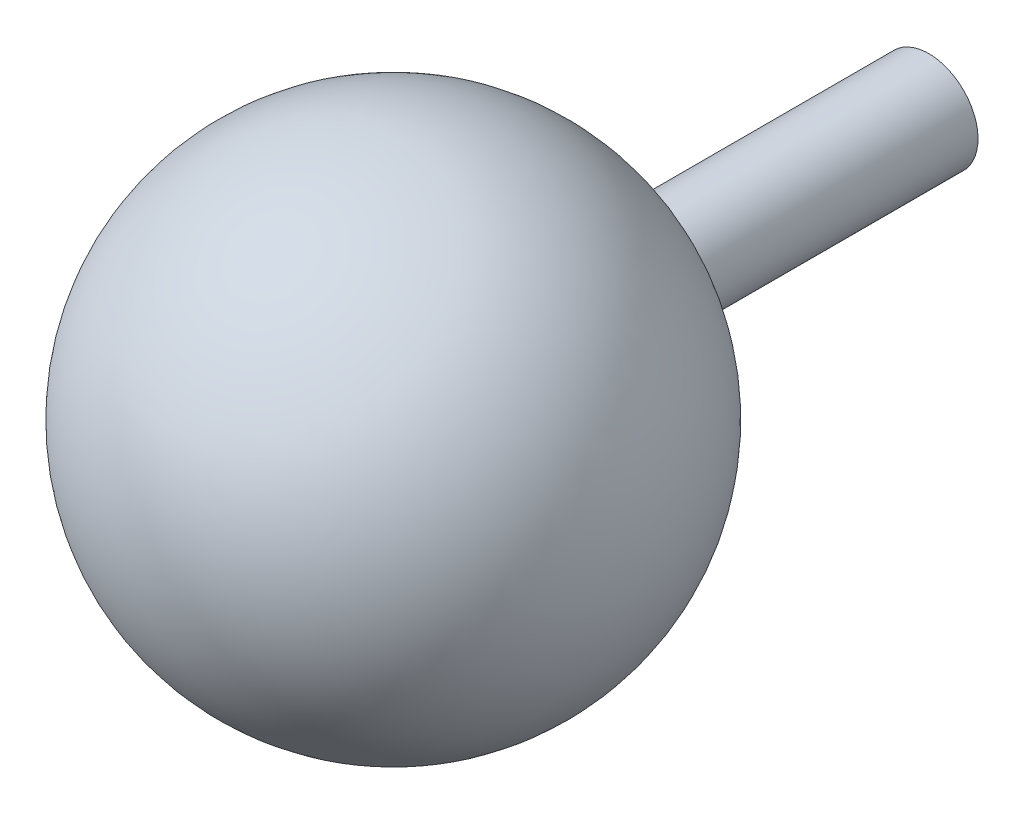
ISO-10303-21;
HEADER;
FILE_DESCRIPTION(('STEP AP214'),'2;1');
FILE_NAME('part.step','',(''),(''),'','','');
FILE_SCHEMA(('AUTOMOTIVE_DESIGN { 1 0 10303 214 1 1 1 1 }'));
ENDSEC;
DATA;
#1=APPLICATION_CONTEXT('core data for automotive mechanical design processes');
#2=APPLICATION_PROTOCOL_DEFINITION('international standard','automotive_design',2000,#1);
#3=PRODUCT_CONTEXT('',#1,'mechanical');
#4=PRODUCT('Part','Part','',(#3));
#5=PRODUCT_RELATED_PRODUCT_CATEGORY('part','',(#4));
#6=PRODUCT_DEFINITION_FORMATION('','',#4);
#7=PRODUCT_DEFINITION_CONTEXT('part definition',#1,'design');
#8=PRODUCT_DEFINITION('design','',#6,#7);
#9=PRODUCT_DEFINITION_SHAPE('','',#8);
#10=(LENGTH_UNIT() NAMED_UNIT(*) SI_UNIT(.MILLI.,.METRE.));
#11=(NAMED_UNIT(*) PLANE_ANGLE_UNIT() SI_UNIT($,.RADIAN.));
#12=(NAMED_UNIT(*) SI_UNIT($,.STERADIAN.) SOLID_ANGLE_UNIT());
#13=UNCERTAINTY_MEASURE_WITH_UNIT(LENGTH_MEASURE(1.E-05),#10,'distance_accuracy_value','');
#14=(GEOMETRIC_REPRESENTATION_CONTEXT(3) GLOBAL_UNCERTAINTY_ASSIGNED_CONTEXT((#13)) GLOBAL_UNIT_ASSIGNED_CONTEXT((#10,
#11,#12)) REPRESENTATION_CONTEXT('',''));
#15=CARTESIAN_POINT('',(0.,0.,0.));
#16=DIRECTION('',(0.,0.,1.));
#17=DIRECTION('',(1.,0.,0.));
#18=AXIS2_PLACEMENT_3D('',#15,#16,#17);
#19=CARTESIAN_POINT('',(0.,-4.45320017350555,0.));
#20=DIRECTION('',(0.,1.,0.));
#21=DIRECTION('',(0.,0.,-1.));
#22=AXIS2_PLACEMENT_3D('',#19,#20,#21);
#23=SPHERICAL_SURFACE('',#22,0.432732289349206);
#24=CARTESIAN_POINT('',(0.,-4.02046788415635,0.));
#25=VERTEX_POINT('',#24);
#26=VERTEX_LOOP('',#25);
#27=FACE_BOUND('',#26,.T.);
#28=ADVANCED_FACE('F58',(#27),#23,.T.);
#29=CLOSED_SHELL('',(#28));
#30=MANIFOLD_SOLID_BREP('B2',#29);
#31=CARTESIAN_POINT('',(0.,0.,0.898979485566357));
#32=DIRECTION('',(0.,0.,1.));
#33=DIRECTION('',(0.,-1.,0.));
#34=AXIS2_PLACEMENT_3D('',#31,#32,#33);
#35=CYLINDRICAL_SURFACE('',#34,1.);
#36=CARTESIAN_POINT('',(0.,0.,-10.8989794855664));
#37=DIRECTION('',(0.,0.,1.));
#38=DIRECTION('',(0.,-1.,0.));
#39=AXIS2_PLACEMENT_3D('',#36,#37,#38);
#40=CIRCLE('',#39,1.);
#41=CARTESIAN_POINT('',(0.,-1.,-10.8989794855664));
#42=VERTEX_POINT('',#41);
#43=EDGE_CURVE('E57',#42,#42,#40,.T.);
#44=ORIENTED_EDGE('',*,*,#43,.T.);
#45=EDGE_LOOP('',(#44));
#46=FACE_BOUND('',#45,.T.);
#47=CARTESIAN_POINT('',(0.,0.,-4.89897948556636));
#48=DIRECTION('',(0.,0.,1.));
#49=DIRECTION('',(0.,-1.,0.));
#50=AXIS2_PLACEMENT_3D('',#47,#48,#49);
#51=CIRCLE('',#50,0.999999999999999);
#52=CARTESIAN_POINT('',(0.,-1.,-4.89897948556636));
#53=VERTEX_POINT('',#52);
#54=EDGE_CURVE('E109',#53,#53,#51,.T.);
#55=ORIENTED_EDGE('',*,*,#54,.F.);
#56=EDGE_LOOP('',(#55));
#57=FACE_BOUND('',#56,.T.);
#58=ADVANCED_FACE('F103',(#46,#57),#35,.T.);
#59=CARTESIAN_POINT('',(0.,0.,-10.8989794855664));
#60=DIRECTION('',(0.,0.,-1.));
#61=DIRECTION('',(0.,1.,0.));
#62=AXIS2_PLACEMENT_3D('',#59,#60,#61);
#63=PLANE('',#62);
#64=ORIENTED_EDGE('',*,*,#43,.F.);
#65=EDGE_LOOP('',(#64));
#66=FACE_BOUND('',#65,.T.);
#67=ADVANCED_FACE('F118',(#66),#63,.T.);
#68=CARTESIAN_POINT('',(0.,0.,-4.89897948556636));
#69=DIRECTION('',(0.,0.,-1.));
#70=DIRECTION('',(0.,1.,0.));
#71=AXIS2_PLACEMENT_3D('',#68,#69,#70);
#72=PLANE('',#71);
#73=ORIENTED_EDGE('',*,*,#54,.T.);
#74=EDGE_LOOP('',(#73));
#75=FACE_BOUND('',#74,.T.);
#76=ADVANCED_FACE('F115',(#75),#72,.F.);
#77=CLOSED_SHELL('',(#58,#67,#76));
#78=MANIFOLD_SOLID_BREP('B6',#77);
#79=CARTESIAN_POINT('',(0.,0.,0.));
#80=DIRECTION('',(0.,1.,0.));
#81=DIRECTION('',(1.,0.,0.));
#82=AXIS2_PLACEMENT_3D('',#79,#80,#81);
#83=SPHERICAL_SURFACE('',#82,4.9);
#84=CARTESIAN_POINT('',(0.,-4.34062112897565,0.));
#85=DIRECTION('',(0.,1.,0.));
#86=DIRECTION('',(0.,0.,1.));
#87=AXIS2_PLACEMENT_3D('',#84,#85,#86);
#88=CIRCLE('',#87,2.27354529637967);
#89=CARTESIAN_POINT('',(0.,-4.34062112897565,2.27354529637967));
#90=VERTEX_POINT('',#89);
#91=EDGE_CURVE('E147',#90,#90,#88,.T.);
#92=ORIENTED_EDGE('',*,*,#91,.F.);
#93=EDGE_LOOP('',(#92));
#94=FACE_BOUND('',#93,.T.);
#95=ADVANCED_FACE('F144',(#94),#83,.F.);
#96=CARTESIAN_POINT('',(0.,-10.,0.));
#97=DIRECTION('',(0.,1.,0.));
#98=DIRECTION('',(0.,0.,1.));
#99=AXIS2_PLACEMENT_3D('',#96,#97,#98);
#100=CYLINDRICAL_SURFACE('',#99,2.27354529637967);
#101=ORIENTED_EDGE('',*,*,#91,.T.);
#102=EDGE_LOOP('',(#101));
#103=FACE_BOUND('',#102,.T.);
#104=CARTESIAN_POINT('',(0.,-4.45320017350555,0.));
#105=DIRECTION('',(0.,1.,0.));
#106=DIRECTION('',(0.,0.,1.));
#107=AXIS2_PLACEMENT_3D('',#104,#105,#106);
#108=CIRCLE('',#107,2.27354529637967);
#109=CARTESIAN_POINT('',(0.,-4.45320017350555,2.27354529637967));
#110=VERTEX_POINT('',#109);
#111=EDGE_CURVE('E102',#110,#110,#108,.T.);
#112=ORIENTED_EDGE('',*,*,#111,.F.);
#113=EDGE_LOOP('',(#112));
#114=FACE_BOUND('',#113,.T.);
#115=ADVANCED_FACE('F158',(#103,#114),#100,.F.);
#116=CARTESIAN_POINT('',(0.,0.,0.));
#117=DIRECTION('',(0.,1.,0.));
#118=DIRECTION('',(1.,0.,0.));
#119=AXIS2_PLACEMENT_3D('',#116,#117,#118);
#120=SPHERICAL_SURFACE('',#119,5.);
#121=ORIENTED_EDGE('',*,*,#111,.T.);
#122=EDGE_LOOP('',(#121));
#123=FACE_BOUND('',#122,.T.);
#124=ADVANCED_FACE('F165',(#123),#120,.T.);
#125=CLOSED_SHELL('',(#95,#115,#124));
#126=MANIFOLD_SOLID_BREP('B52',#125);
#127=ADVANCED_BREP_SHAPE_REPRESENTATION('',(#18,#30,#78,#126),#14);
#128=SHAPE_DEFINITION_REPRESENTATION(#9,#127);
ENDSEC;
END-ISO-10303-21;
